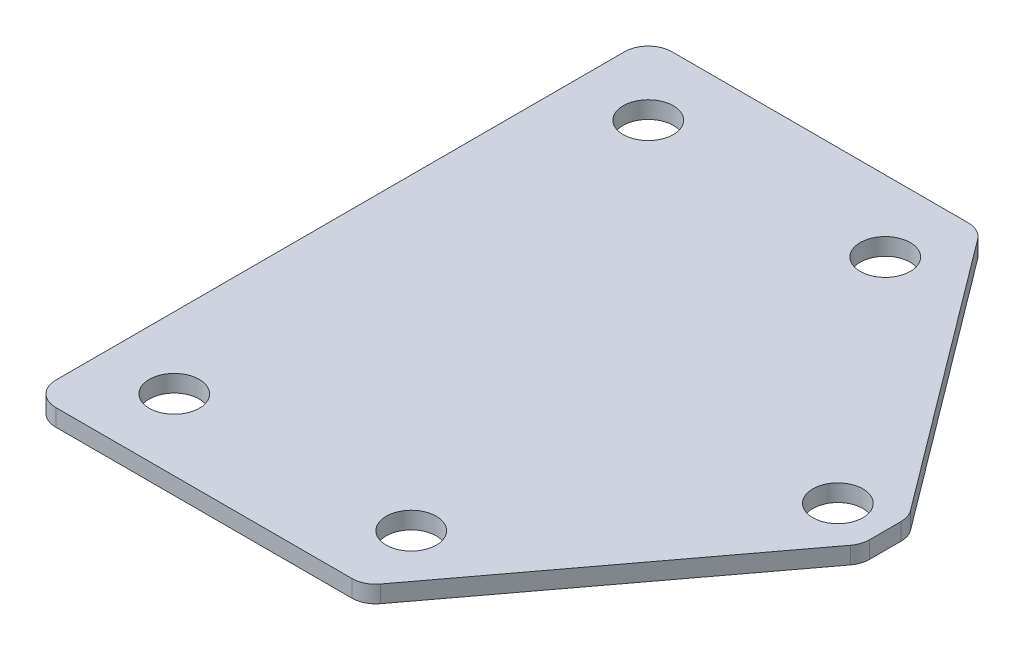
ISO-10303-21;
HEADER;
FILE_DESCRIPTION(('STEP AP214'),'2;1');
FILE_NAME('part.step','',(''),(''),'','','');
FILE_SCHEMA(('AUTOMOTIVE_DESIGN { 1 0 10303 214 1 1 1 1 }'));
ENDSEC;
DATA;
#1=APPLICATION_CONTEXT('core data for automotive mechanical design processes');
#2=APPLICATION_PROTOCOL_DEFINITION('international standard','automotive_design',2000,#1);
#3=PRODUCT_CONTEXT('',#1,'mechanical');
#4=PRODUCT('Part','Part','',(#3));
#5=PRODUCT_RELATED_PRODUCT_CATEGORY('part','',(#4));
#6=PRODUCT_DEFINITION_FORMATION('','',#4);
#7=PRODUCT_DEFINITION_CONTEXT('part definition',#1,'design');
#8=PRODUCT_DEFINITION('design','',#6,#7);
#9=PRODUCT_DEFINITION_SHAPE('','',#8);
#10=(LENGTH_UNIT() NAMED_UNIT(*) SI_UNIT(.MILLI.,.METRE.));
#11=(NAMED_UNIT(*) PLANE_ANGLE_UNIT() SI_UNIT($,.RADIAN.));
#12=(NAMED_UNIT(*) SI_UNIT($,.STERADIAN.) SOLID_ANGLE_UNIT());
#13=UNCERTAINTY_MEASURE_WITH_UNIT(LENGTH_MEASURE(1.E-05),#10,'distance_accuracy_value','');
#14=(GEOMETRIC_REPRESENTATION_CONTEXT(3) GLOBAL_UNCERTAINTY_ASSIGNED_CONTEXT((#13)) GLOBAL_UNIT_ASSIGNED_CONTEXT((#10,
#11,#12)) REPRESENTATION_CONTEXT('',''));
#15=CARTESIAN_POINT('',(0.,0.,0.));
#16=DIRECTION('',(0.,0.,1.));
#17=DIRECTION('',(1.,0.,0.));
#18=AXIS2_PLACEMENT_3D('',#15,#16,#17);
#19=CARTESIAN_POINT('',(0.,0.,0.));
#20=DIRECTION('',(0.,-1.,0.));
#21=DIRECTION('',(0.,0.,-1.));
#22=AXIS2_PLACEMENT_3D('',#19,#20,#21);
#23=PLANE('',#22);
#24=CARTESIAN_POINT('',(4.7625,0.,9.525));
#25=DIRECTION('',(0.,1.,0.));
#26=DIRECTION('',(0.,0.,1.));
#27=AXIS2_PLACEMENT_3D('',#24,#25,#26);
#28=CIRCLE('',#27,3.3528);
#29=CARTESIAN_POINT('',(4.7625,0.,12.8778));
#30=VERTEX_POINT('',#29);
#31=EDGE_CURVE('E194',#30,#30,#28,.T.);
#32=ORIENTED_EDGE('',*,*,#31,.T.);
#33=EDGE_LOOP('',(#32));
#34=FACE_BOUND('',#33,.T.);
#35=CARTESIAN_POINT('',(4.7625,0.,73.025));
#36=DIRECTION('',(0.,1.,0.));
#37=DIRECTION('',(0.,0.,1.));
#38=AXIS2_PLACEMENT_3D('',#35,#36,#37);
#39=CIRCLE('',#38,3.3528);
#40=CARTESIAN_POINT('',(4.7625,0.,76.3778));
#41=VERTEX_POINT('',#40);
#42=EDGE_CURVE('E133',#41,#41,#39,.T.);
#43=ORIENTED_EDGE('',*,*,#42,.T.);
#44=EDGE_LOOP('',(#43));
#45=FACE_BOUND('',#44,.T.);
#46=CARTESIAN_POINT('',(-26.9875,0.,73.025));
#47=DIRECTION('',(0.,1.,0.));
#48=DIRECTION('',(0.,0.,1.));
#49=AXIS2_PLACEMENT_3D('',#46,#47,#48);
#50=CIRCLE('',#49,3.3528);
#51=CARTESIAN_POINT('',(-26.9875,0.,76.3778));
#52=VERTEX_POINT('',#51);
#53=EDGE_CURVE('E116',#52,#52,#50,.T.);
#54=ORIENTED_EDGE('',*,*,#53,.T.);
#55=EDGE_LOOP('',(#54));
#56=FACE_BOUND('',#55,.T.);
#57=CARTESIAN_POINT('',(-26.9875,0.,9.525));
#58=DIRECTION('',(0.,1.,0.));
#59=DIRECTION('',(0.,0.,1.));
#60=AXIS2_PLACEMENT_3D('',#57,#58,#59);
#61=CIRCLE('',#60,3.3528);
#62=CARTESIAN_POINT('',(-26.9875,0.,12.8778));
#63=VERTEX_POINT('',#62);
#64=EDGE_CURVE('E216',#63,#63,#61,.T.);
#65=ORIENTED_EDGE('',*,*,#64,.T.);
#66=EDGE_LOOP('',(#65));
#67=FACE_BOUND('',#66,.T.);
#68=CARTESIAN_POINT('',(30.1625,0.,41.275));
#69=DIRECTION('',(0.,1.,0.));
#70=DIRECTION('',(0.,0.,1.));
#71=AXIS2_PLACEMENT_3D('',#68,#69,#70);
#72=CIRCLE('',#71,3.3528);
#73=CARTESIAN_POINT('',(30.1625,0.,44.6278));
#74=VERTEX_POINT('',#73);
#75=EDGE_CURVE('E221',#74,#74,#72,.T.);
#76=ORIENTED_EDGE('',*,*,#75,.T.);
#77=EDGE_LOOP('',(#76));
#78=FACE_BOUND('',#77,.T.);
#79=DIRECTION('',(1.,0.,0.));
#80=VECTOR('',#79,1.);
#81=CARTESIAN_POINT('',(-36.5125,0.,0.));
#82=LINE('',#81,#80);
#83=CARTESIAN_POINT('',(-33.3375,0.,0.));
#84=VERTEX_POINT('',#83);
#85=CARTESIAN_POINT('',(6.35,0.,0.));
#86=VERTEX_POINT('',#85);
#87=EDGE_CURVE('E139',#84,#86,#82,.T.);
#88=ORIENTED_EDGE('',*,*,#87,.T.);
#89=CARTESIAN_POINT('',(6.35,0.,3.175));
#90=DIRECTION('',(0.,1.,0.));
#91=DIRECTION('',(0.,0.,1.));
#92=AXIS2_PLACEMENT_3D('',#89,#90,#91);
#93=CIRCLE('',#92,3.175);
#94=CARTESIAN_POINT('',(8.89,0.,1.27));
#95=VERTEX_POINT('',#94);
#96=EDGE_CURVE('E141',#95,#86,#93,.T.);
#97=ORIENTED_EDGE('',*,*,#96,.F.);
#98=DIRECTION('',(0.6,0.,0.8));
#99=VECTOR('',#98,1.);
#100=CARTESIAN_POINT('',(7.9375,0.,0.));
#101=LINE('',#100,#99);
#102=CARTESIAN_POINT('',(35.8775,0.,37.2533333333333));
#103=VERTEX_POINT('',#102);
#104=EDGE_CURVE('E134',#95,#103,#101,.T.);
#105=ORIENTED_EDGE('',*,*,#104,.T.);
#106=CARTESIAN_POINT('',(33.3375,0.,39.1583333333333));
#107=DIRECTION('',(0.,1.,0.));
#108=DIRECTION('',(0.,0.,1.));
#109=AXIS2_PLACEMENT_3D('',#106,#107,#108);
#110=CIRCLE('',#109,3.175);
#111=CARTESIAN_POINT('',(36.5125,0.,39.1583333333333));
#112=VERTEX_POINT('',#111);
#113=EDGE_CURVE('E137',#112,#103,#110,.T.);
#114=ORIENTED_EDGE('',*,*,#113,.F.);
#115=DIRECTION('',(0.,0.,1.));
#116=VECTOR('',#115,1.);
#117=CARTESIAN_POINT('',(36.5125,0.,82.55));
#118=LINE('',#117,#116);
#119=CARTESIAN_POINT('',(36.5125,0.,43.3916666666667));
#120=VERTEX_POINT('',#119);
#121=EDGE_CURVE('E110',#112,#120,#118,.T.);
#122=ORIENTED_EDGE('',*,*,#121,.T.);
#123=CARTESIAN_POINT('',(33.3375,0.,43.3916666666667));
#124=DIRECTION('',(0.,1.,0.));
#125=DIRECTION('',(0.,0.,1.));
#126=AXIS2_PLACEMENT_3D('',#123,#124,#125);
#127=CIRCLE('',#126,3.175);
#128=CARTESIAN_POINT('',(35.8775,0.,45.2966666666667));
#129=VERTEX_POINT('',#128);
#130=EDGE_CURVE('E105',#129,#120,#127,.T.);
#131=ORIENTED_EDGE('',*,*,#130,.F.);
#132=DIRECTION('',(-0.6,0.,0.8));
#133=VECTOR('',#132,1.);
#134=CARTESIAN_POINT('',(36.5125,0.,44.45));
#135=LINE('',#134,#133);
#136=CARTESIAN_POINT('',(8.89,0.,81.28));
#137=VERTEX_POINT('',#136);
#138=EDGE_CURVE('E108',#129,#137,#135,.T.);
#139=ORIENTED_EDGE('',*,*,#138,.T.);
#140=CARTESIAN_POINT('',(6.35,0.,79.375));
#141=DIRECTION('',(0.,1.,0.));
#142=DIRECTION('',(0.,0.,1.));
#143=AXIS2_PLACEMENT_3D('',#140,#141,#142);
#144=CIRCLE('',#143,3.175);
#145=CARTESIAN_POINT('',(6.35,0.,82.55));
#146=VERTEX_POINT('',#145);
#147=EDGE_CURVE('E123',#146,#137,#144,.T.);
#148=ORIENTED_EDGE('',*,*,#147,.F.);
#149=DIRECTION('',(-1.,0.,0.));
#150=VECTOR('',#149,1.);
#151=CARTESIAN_POINT('',(-36.5125,0.,82.55));
#152=LINE('',#151,#150);
#153=CARTESIAN_POINT('',(-33.3375,0.,82.55));
#154=VERTEX_POINT('',#153);
#155=EDGE_CURVE('E148',#146,#154,#152,.T.);
#156=ORIENTED_EDGE('',*,*,#155,.T.);
#157=CARTESIAN_POINT('',(-33.3375,0.,79.375));
#158=DIRECTION('',(0.,-1.,0.));
#159=DIRECTION('',(0.,0.,-1.));
#160=AXIS2_PLACEMENT_3D('',#157,#158,#159);
#161=CIRCLE('',#160,3.175);
#162=CARTESIAN_POINT('',(-36.5125,0.,79.375));
#163=VERTEX_POINT('',#162);
#164=EDGE_CURVE('E150',#163,#154,#161,.F.);
#165=ORIENTED_EDGE('',*,*,#164,.F.);
#166=DIRECTION('',(0.,0.,-1.));
#167=VECTOR('',#166,1.);
#168=CARTESIAN_POINT('',(-36.5125,0.,82.55));
#169=LINE('',#168,#167);
#170=CARTESIAN_POINT('',(-36.5125,0.,3.175));
#171=VERTEX_POINT('',#170);
#172=EDGE_CURVE('E143',#163,#171,#169,.T.);
#173=ORIENTED_EDGE('',*,*,#172,.T.);
#174=CARTESIAN_POINT('',(-33.3375,0.,3.175));
#175=DIRECTION('',(0.,-1.,0.));
#176=DIRECTION('',(0.,0.,-1.));
#177=AXIS2_PLACEMENT_3D('',#174,#175,#176);
#178=CIRCLE('',#177,3.175);
#179=EDGE_CURVE('E146',#84,#171,#178,.F.);
#180=ORIENTED_EDGE('',*,*,#179,.F.);
#181=EDGE_LOOP('',(#88,#97,#105,#114,#122,#131,#139,#148,#156,#165,#173,#180));
#182=FACE_BOUND('',#181,.T.);
#183=ADVANCED_FACE('F17',(#34,#45,#56,#67,#78,#182),#23,.T.);
#184=CARTESIAN_POINT('',(30.1625,0.,41.275));
#185=DIRECTION('',(0.,1.,0.));
#186=DIRECTION('',(0.,0.,1.));
#187=AXIS2_PLACEMENT_3D('',#184,#185,#186);
#188=CYLINDRICAL_SURFACE('',#187,3.3528);
#189=CARTESIAN_POINT('',(30.1625,2.286,41.275));
#190=DIRECTION('',(0.,1.,0.));
#191=DIRECTION('',(0.,0.,1.));
#192=AXIS2_PLACEMENT_3D('',#189,#190,#191);
#193=CIRCLE('',#192,3.3528);
#194=CARTESIAN_POINT('',(30.1625,2.286,44.6278));
#195=VERTEX_POINT('',#194);
#196=EDGE_CURVE('E189',#195,#195,#193,.T.);
#197=ORIENTED_EDGE('',*,*,#196,.T.);
#198=EDGE_LOOP('',(#197));
#199=FACE_BOUND('',#198,.T.);
#200=ORIENTED_EDGE('',*,*,#75,.F.);
#201=EDGE_LOOP('',(#200));
#202=FACE_BOUND('',#201,.T.);
#203=ADVANCED_FACE('F227',(#199,#202),#188,.F.);
#204=CARTESIAN_POINT('',(-26.9875,0.,9.525));
#205=DIRECTION('',(0.,1.,0.));
#206=DIRECTION('',(0.,0.,1.));
#207=AXIS2_PLACEMENT_3D('',#204,#205,#206);
#208=CYLINDRICAL_SURFACE('',#207,3.3528);
#209=CARTESIAN_POINT('',(-26.9875,2.286,9.525));
#210=DIRECTION('',(0.,1.,0.));
#211=DIRECTION('',(0.,0.,1.));
#212=AXIS2_PLACEMENT_3D('',#209,#210,#211);
#213=CIRCLE('',#212,3.3528);
#214=CARTESIAN_POINT('',(-26.9875,2.286,12.8778));
#215=VERTEX_POINT('',#214);
#216=EDGE_CURVE('E184',#215,#215,#213,.T.);
#217=ORIENTED_EDGE('',*,*,#216,.T.);
#218=EDGE_LOOP('',(#217));
#219=FACE_BOUND('',#218,.T.);
#220=ORIENTED_EDGE('',*,*,#64,.F.);
#221=EDGE_LOOP('',(#220));
#222=FACE_BOUND('',#221,.T.);
#223=ADVANCED_FACE('F229',(#219,#222),#208,.F.);
#224=CARTESIAN_POINT('',(-26.9875,0.,73.025));
#225=DIRECTION('',(0.,1.,0.));
#226=DIRECTION('',(0.,0.,1.));
#227=AXIS2_PLACEMENT_3D('',#224,#225,#226);
#228=CYLINDRICAL_SURFACE('',#227,3.3528);
#229=CARTESIAN_POINT('',(-26.9875,2.286,73.025));
#230=DIRECTION('',(0.,1.,0.));
#231=DIRECTION('',(0.,0.,1.));
#232=AXIS2_PLACEMENT_3D('',#229,#230,#231);
#233=CIRCLE('',#232,3.3528);
#234=CARTESIAN_POINT('',(-26.9875,2.286,76.3778));
#235=VERTEX_POINT('',#234);
#236=EDGE_CURVE('E181',#235,#235,#233,.T.);
#237=ORIENTED_EDGE('',*,*,#236,.T.);
#238=EDGE_LOOP('',(#237));
#239=FACE_BOUND('',#238,.T.);
#240=ORIENTED_EDGE('',*,*,#53,.F.);
#241=EDGE_LOOP('',(#240));
#242=FACE_BOUND('',#241,.T.);
#243=ADVANCED_FACE('F236',(#239,#242),#228,.F.);
#244=CARTESIAN_POINT('',(33.3375,0.,43.3916666666667));
#245=DIRECTION('',(0.,1.,0.));
#246=DIRECTION('',(0.,0.,1.));
#247=AXIS2_PLACEMENT_3D('',#244,#245,#246);
#248=CYLINDRICAL_SURFACE('',#247,3.175);
#249=CARTESIAN_POINT('',(33.3375,2.286,43.3916666666667));
#250=DIRECTION('',(0.,1.,0.));
#251=DIRECTION('',(0.,0.,1.));
#252=AXIS2_PLACEMENT_3D('',#249,#250,#251);
#253=CIRCLE('',#252,3.175);
#254=CARTESIAN_POINT('',(36.5125,2.286,43.3916666666667));
#255=VERTEX_POINT('',#254);
#256=CARTESIAN_POINT('',(35.8775,2.286,45.2966666666667));
#257=VERTEX_POINT('',#256);
#258=EDGE_CURVE('E127',#255,#257,#253,.F.);
#259=ORIENTED_EDGE('',*,*,#258,.T.);
#260=DIRECTION('',(0.,1.,0.));
#261=VECTOR('',#260,1.);
#262=CARTESIAN_POINT('',(35.8775,0.,45.2966666666667));
#263=LINE('',#262,#261);
#264=EDGE_CURVE('E115',#257,#129,#263,.F.);
#265=ORIENTED_EDGE('',*,*,#264,.T.);
#266=ORIENTED_EDGE('',*,*,#130,.T.);
#267=DIRECTION('',(0.,1.,0.));
#268=VECTOR('',#267,1.);
#269=CARTESIAN_POINT('',(36.5125,2.286,43.3916666666667));
#270=LINE('',#269,#268);
#271=EDGE_CURVE('E443',#120,#255,#270,.T.);
#272=ORIENTED_EDGE('',*,*,#271,.T.);
#273=EDGE_LOOP('',(#259,#265,#266,#272));
#274=FACE_BOUND('',#273,.T.);
#275=ADVANCED_FACE('F126',(#274),#248,.T.);
#276=CARTESIAN_POINT('',(36.5125,0.,44.45));
#277=DIRECTION('',(-0.8,0.,-0.6));
#278=DIRECTION('',(-0.6,0.,0.8));
#279=AXIS2_PLACEMENT_3D('',#276,#277,#278);
#280=PLANE('',#279);
#281=ORIENTED_EDGE('',*,*,#264,.F.);
#282=DIRECTION('',(-0.6,0.,0.8));
#283=VECTOR('',#282,1.);
#284=CARTESIAN_POINT('',(35.8775,2.286,45.2966666666667));
#285=LINE('',#284,#283);
#286=CARTESIAN_POINT('',(8.89,2.286,81.28));
#287=VERTEX_POINT('',#286);
#288=EDGE_CURVE('E179',#257,#287,#285,.T.);
#289=ORIENTED_EDGE('',*,*,#288,.T.);
#290=DIRECTION('',(0.,1.,0.));
#291=VECTOR('',#290,1.);
#292=CARTESIAN_POINT('',(8.89,2.286,81.28));
#293=LINE('',#292,#291);
#294=EDGE_CURVE('E122',#137,#287,#293,.T.);
#295=ORIENTED_EDGE('',*,*,#294,.F.);
#296=ORIENTED_EDGE('',*,*,#138,.F.);
#297=EDGE_LOOP('',(#281,#289,#295,#296));
#298=FACE_BOUND('',#297,.T.);
#299=ADVANCED_FACE('F119',(#298),#280,.F.);
#300=CARTESIAN_POINT('',(6.35,2.286,79.375));
#301=DIRECTION('',(0.,1.,0.));
#302=DIRECTION('',(0.,0.,1.));
#303=AXIS2_PLACEMENT_3D('',#300,#301,#302);
#304=CYLINDRICAL_SURFACE('',#303,3.175);
#305=CARTESIAN_POINT('',(6.35,2.286,79.375));
#306=DIRECTION('',(0.,1.,0.));
#307=DIRECTION('',(0.,0.,1.));
#308=AXIS2_PLACEMENT_3D('',#305,#306,#307);
#309=CIRCLE('',#308,3.175);
#310=CARTESIAN_POINT('',(6.35,2.286,82.55));
#311=VERTEX_POINT('',#310);
#312=EDGE_CURVE('E176',#287,#311,#309,.F.);
#313=ORIENTED_EDGE('',*,*,#312,.T.);
#314=DIRECTION('',(0.,1.,0.));
#315=VECTOR('',#314,1.);
#316=CARTESIAN_POINT('',(6.35,2.286,82.55));
#317=LINE('',#316,#315);
#318=EDGE_CURVE('E151',#311,#146,#317,.F.);
#319=ORIENTED_EDGE('',*,*,#318,.T.);
#320=ORIENTED_EDGE('',*,*,#147,.T.);
#321=ORIENTED_EDGE('',*,*,#294,.T.);
#322=EDGE_LOOP('',(#313,#319,#320,#321));
#323=FACE_BOUND('',#322,.T.);
#324=ADVANCED_FACE('F291',(#323),#304,.T.);
#325=CARTESIAN_POINT('',(-36.5125,2.286,82.55));
#326=DIRECTION('',(0.,0.,-1.));
#327=DIRECTION('',(-1.,0.,0.));
#328=AXIS2_PLACEMENT_3D('',#325,#326,#327);
#329=PLANE('',#328);
#330=ORIENTED_EDGE('',*,*,#318,.F.);
#331=DIRECTION('',(1.,0.,0.));
#332=VECTOR('',#331,1.);
#333=CARTESIAN_POINT('',(0.,2.286,82.55));
#334=LINE('',#333,#332);
#335=CARTESIAN_POINT('',(-33.3375,2.286,82.55));
#336=VERTEX_POINT('',#335);
#337=EDGE_CURVE('E175',#311,#336,#334,.F.);
#338=ORIENTED_EDGE('',*,*,#337,.T.);
#339=DIRECTION('',(0.,-1.,0.));
#340=VECTOR('',#339,1.);
#341=CARTESIAN_POINT('',(-33.3375,2.286,82.55));
#342=LINE('',#341,#340);
#343=EDGE_CURVE('E212',#154,#336,#342,.F.);
#344=ORIENTED_EDGE('',*,*,#343,.F.);
#345=ORIENTED_EDGE('',*,*,#155,.F.);
#346=EDGE_LOOP('',(#330,#338,#344,#345));
#347=FACE_BOUND('',#346,.T.);
#348=ADVANCED_FACE('F287',(#347),#329,.F.);
#349=CARTESIAN_POINT('',(-33.3375,2.286,79.375));
#350=DIRECTION('',(0.,-1.,0.));
#351=DIRECTION('',(0.,0.,-1.));
#352=AXIS2_PLACEMENT_3D('',#349,#350,#351);
#353=CYLINDRICAL_SURFACE('',#352,3.175);
#354=ORIENTED_EDGE('',*,*,#164,.T.);
#355=ORIENTED_EDGE('',*,*,#343,.T.);
#356=CARTESIAN_POINT('',(-33.3375,2.286,79.375));
#357=DIRECTION('',(0.,-1.,0.));
#358=DIRECTION('',(0.,0.,-1.));
#359=AXIS2_PLACEMENT_3D('',#356,#357,#358);
#360=CIRCLE('',#359,3.175);
#361=CARTESIAN_POINT('',(-36.5125,2.286,79.375));
#362=VERTEX_POINT('',#361);
#363=EDGE_CURVE('E172',#336,#362,#360,.T.);
#364=ORIENTED_EDGE('',*,*,#363,.T.);
#365=DIRECTION('',(0.,1.,0.));
#366=VECTOR('',#365,1.);
#367=CARTESIAN_POINT('',(-36.5125,2.286,79.375));
#368=LINE('',#367,#366);
#369=EDGE_CURVE('E147',#362,#163,#368,.F.);
#370=ORIENTED_EDGE('',*,*,#369,.T.);
#371=EDGE_LOOP('',(#354,#355,#364,#370));
#372=FACE_BOUND('',#371,.T.);
#373=ADVANCED_FACE('F283',(#372),#353,.T.);
#374=CARTESIAN_POINT('',(-36.5125,2.286,82.55));
#375=DIRECTION('',(1.,0.,0.));
#376=DIRECTION('',(0.,0.,-1.));
#377=AXIS2_PLACEMENT_3D('',#374,#375,#376);
#378=PLANE('',#377);
#379=ORIENTED_EDGE('',*,*,#369,.F.);
#380=DIRECTION('',(0.,0.,-1.));
#381=VECTOR('',#380,1.);
#382=CARTESIAN_POINT('',(-36.5125,2.286,0.));
#383=LINE('',#382,#381);
#384=CARTESIAN_POINT('',(-36.5125,2.286,3.175));
#385=VERTEX_POINT('',#384);
#386=EDGE_CURVE('E171',#362,#385,#383,.T.);
#387=ORIENTED_EDGE('',*,*,#386,.T.);
#388=DIRECTION('',(0.,-1.,0.));
#389=VECTOR('',#388,1.);
#390=CARTESIAN_POINT('',(-36.5125,2.286,3.175));
#391=LINE('',#390,#389);
#392=EDGE_CURVE('E210',#171,#385,#391,.F.);
#393=ORIENTED_EDGE('',*,*,#392,.F.);
#394=ORIENTED_EDGE('',*,*,#172,.F.);
#395=EDGE_LOOP('',(#379,#387,#393,#394));
#396=FACE_BOUND('',#395,.T.);
#397=ADVANCED_FACE('F279',(#396),#378,.F.);
#398=CARTESIAN_POINT('',(-33.3375,2.286,3.175));
#399=DIRECTION('',(0.,-1.,0.));
#400=DIRECTION('',(0.,0.,-1.));
#401=AXIS2_PLACEMENT_3D('',#398,#399,#400);
#402=CYLINDRICAL_SURFACE('',#401,3.175);
#403=ORIENTED_EDGE('',*,*,#179,.T.);
#404=ORIENTED_EDGE('',*,*,#392,.T.);
#405=CARTESIAN_POINT('',(-33.3375,2.286,3.175));
#406=DIRECTION('',(0.,-1.,0.));
#407=DIRECTION('',(0.,0.,-1.));
#408=AXIS2_PLACEMENT_3D('',#405,#406,#407);
#409=CIRCLE('',#408,3.175);
#410=CARTESIAN_POINT('',(-33.3375,2.286,0.));
#411=VERTEX_POINT('',#410);
#412=EDGE_CURVE('E168',#385,#411,#409,.T.);
#413=ORIENTED_EDGE('',*,*,#412,.T.);
#414=DIRECTION('',(0.,1.,0.));
#415=VECTOR('',#414,1.);
#416=CARTESIAN_POINT('',(-33.3375,2.286,0.));
#417=LINE('',#416,#415);
#418=EDGE_CURVE('E142',#411,#84,#417,.F.);
#419=ORIENTED_EDGE('',*,*,#418,.T.);
#420=EDGE_LOOP('',(#403,#404,#413,#419));
#421=FACE_BOUND('',#420,.T.);
#422=ADVANCED_FACE('F275',(#421),#402,.T.);
#423=CARTESIAN_POINT('',(-36.5125,2.286,0.));
#424=DIRECTION('',(0.,0.,1.));
#425=DIRECTION('',(1.,0.,0.));
#426=AXIS2_PLACEMENT_3D('',#423,#424,#425);
#427=PLANE('',#426);
#428=DIRECTION('',(0.,1.,0.));
#429=VECTOR('',#428,1.);
#430=CARTESIAN_POINT('',(6.35,0.,0.));
#431=LINE('',#430,#429);
#432=CARTESIAN_POINT('',(6.35,2.286,0.));
#433=VERTEX_POINT('',#432);
#434=EDGE_CURVE('E208',#86,#433,#431,.T.);
#435=ORIENTED_EDGE('',*,*,#434,.F.);
#436=ORIENTED_EDGE('',*,*,#87,.F.);
#437=ORIENTED_EDGE('',*,*,#418,.F.);
#438=DIRECTION('',(1.,0.,0.));
#439=VECTOR('',#438,1.);
#440=CARTESIAN_POINT('',(0.,2.286,0.));
#441=LINE('',#440,#439);
#442=EDGE_CURVE('E167',#411,#433,#441,.T.);
#443=ORIENTED_EDGE('',*,*,#442,.T.);
#444=EDGE_LOOP('',(#435,#436,#437,#443));
#445=FACE_BOUND('',#444,.T.);
#446=ADVANCED_FACE('F271',(#445),#427,.F.);
#447=CARTESIAN_POINT('',(6.35,0.,3.175));
#448=DIRECTION('',(0.,1.,0.));
#449=DIRECTION('',(0.,0.,1.));
#450=AXIS2_PLACEMENT_3D('',#447,#448,#449);
#451=CYLINDRICAL_SURFACE('',#450,3.175);
#452=CARTESIAN_POINT('',(6.35,2.286,3.175));
#453=DIRECTION('',(0.,1.,0.));
#454=DIRECTION('',(0.,0.,1.));
#455=AXIS2_PLACEMENT_3D('',#452,#453,#454);
#456=CIRCLE('',#455,3.175);
#457=CARTESIAN_POINT('',(8.89,2.286,1.27));
#458=VERTEX_POINT('',#457);
#459=EDGE_CURVE('E164',#433,#458,#456,.F.);
#460=ORIENTED_EDGE('',*,*,#459,.T.);
#461=DIRECTION('',(0.,1.,0.));
#462=VECTOR('',#461,1.);
#463=CARTESIAN_POINT('',(8.89,0.,1.27));
#464=LINE('',#463,#462);
#465=EDGE_CURVE('E138',#458,#95,#464,.F.);
#466=ORIENTED_EDGE('',*,*,#465,.T.);
#467=ORIENTED_EDGE('',*,*,#96,.T.);
#468=ORIENTED_EDGE('',*,*,#434,.T.);
#469=EDGE_LOOP('',(#460,#466,#467,#468));
#470=FACE_BOUND('',#469,.T.);
#471=ADVANCED_FACE('F267',(#470),#451,.T.);
#472=CARTESIAN_POINT('',(7.9375,0.,0.));
#473=DIRECTION('',(-0.8,0.,0.6));
#474=DIRECTION('',(0.6,0.,0.8));
#475=AXIS2_PLACEMENT_3D('',#472,#473,#474);
#476=PLANE('',#475);
#477=DIRECTION('',(0.,1.,0.));
#478=VECTOR('',#477,1.);
#479=CARTESIAN_POINT('',(35.8775,2.286,37.2533333333333));
#480=LINE('',#479,#478);
#481=CARTESIAN_POINT('',(35.8775,2.286,37.2533333333333));
#482=VERTEX_POINT('',#481);
#483=EDGE_CURVE('E206',#103,#482,#480,.T.);
#484=ORIENTED_EDGE('',*,*,#483,.F.);
#485=ORIENTED_EDGE('',*,*,#104,.F.);
#486=ORIENTED_EDGE('',*,*,#465,.F.);
#487=DIRECTION('',(0.6,0.,0.8));
#488=VECTOR('',#487,1.);
#489=CARTESIAN_POINT('',(8.89,2.286,1.27));
#490=LINE('',#489,#488);
#491=EDGE_CURVE('E163',#458,#482,#490,.T.);
#492=ORIENTED_EDGE('',*,*,#491,.T.);
#493=EDGE_LOOP('',(#484,#485,#486,#492));
#494=FACE_BOUND('',#493,.T.);
#495=ADVANCED_FACE('F263',(#494),#476,.F.);
#496=CARTESIAN_POINT('',(33.3375,2.286,39.1583333333333));
#497=DIRECTION('',(0.,1.,0.));
#498=DIRECTION('',(0.,0.,1.));
#499=AXIS2_PLACEMENT_3D('',#496,#497,#498);
#500=CYLINDRICAL_SURFACE('',#499,3.175);
#501=CARTESIAN_POINT('',(33.3375,2.286,39.1583333333333));
#502=DIRECTION('',(0.,1.,0.));
#503=DIRECTION('',(0.,0.,1.));
#504=AXIS2_PLACEMENT_3D('',#501,#502,#503);
#505=CIRCLE('',#504,3.175);
#506=CARTESIAN_POINT('',(36.5125,2.286,39.1583333333333));
#507=VERTEX_POINT('',#506);
#508=EDGE_CURVE('E160',#482,#507,#505,.F.);
#509=ORIENTED_EDGE('',*,*,#508,.T.);
#510=DIRECTION('',(0.,1.,0.));
#511=VECTOR('',#510,1.);
#512=CARTESIAN_POINT('',(36.5125,2.286,39.1583333333333));
#513=LINE('',#512,#511);
#514=EDGE_CURVE('E35',#507,#112,#513,.F.);
#515=ORIENTED_EDGE('',*,*,#514,.T.);
#516=ORIENTED_EDGE('',*,*,#113,.T.);
#517=ORIENTED_EDGE('',*,*,#483,.T.);
#518=EDGE_LOOP('',(#509,#515,#516,#517));
#519=FACE_BOUND('',#518,.T.);
#520=ADVANCED_FACE('F260',(#519),#500,.T.);
#521=CARTESIAN_POINT('',(36.5125,2.286,82.55));
#522=DIRECTION('',(-1.,0.,0.));
#523=DIRECTION('',(0.,0.,1.));
#524=AXIS2_PLACEMENT_3D('',#521,#522,#523);
#525=PLANE('',#524);
#526=ORIENTED_EDGE('',*,*,#514,.F.);
#527=DIRECTION('',(0.,0.,-1.));
#528=VECTOR('',#527,1.);
#529=CARTESIAN_POINT('',(36.5125,2.286,0.));
#530=LINE('',#529,#528);
#531=EDGE_CURVE('E157',#507,#255,#530,.F.);
#532=ORIENTED_EDGE('',*,*,#531,.T.);
#533=ORIENTED_EDGE('',*,*,#271,.F.);
#534=ORIENTED_EDGE('',*,*,#121,.F.);
#535=EDGE_LOOP('',(#526,#532,#533,#534));
#536=FACE_BOUND('',#535,.T.);
#537=ADVANCED_FACE('F256',(#536),#525,.F.);
#538=CARTESIAN_POINT('',(4.7625,0.,73.025));
#539=DIRECTION('',(0.,1.,0.));
#540=DIRECTION('',(0.,0.,1.));
#541=AXIS2_PLACEMENT_3D('',#538,#539,#540);
#542=CYLINDRICAL_SURFACE('',#541,3.3528);
#543=CARTESIAN_POINT('',(4.7625,2.286,73.025));
#544=DIRECTION('',(0.,1.,0.));
#545=DIRECTION('',(0.,0.,1.));
#546=AXIS2_PLACEMENT_3D('',#543,#544,#545);
#547=CIRCLE('',#546,3.3528);
#548=CARTESIAN_POINT('',(4.7625,2.286,76.3778));
#549=VERTEX_POINT('',#548);
#550=EDGE_CURVE('E26',#549,#549,#547,.T.);
#551=ORIENTED_EDGE('',*,*,#550,.T.);
#552=EDGE_LOOP('',(#551));
#553=FACE_BOUND('',#552,.T.);
#554=ORIENTED_EDGE('',*,*,#42,.F.);
#555=EDGE_LOOP('',(#554));
#556=FACE_BOUND('',#555,.T.);
#557=ADVANCED_FACE('F248',(#553,#556),#542,.F.);
#558=CARTESIAN_POINT('',(4.7625,0.,9.525));
#559=DIRECTION('',(0.,1.,0.));
#560=DIRECTION('',(0.,0.,1.));
#561=AXIS2_PLACEMENT_3D('',#558,#559,#560);
#562=CYLINDRICAL_SURFACE('',#561,3.3528);
#563=CARTESIAN_POINT('',(4.7625,2.286,9.525));
#564=DIRECTION('',(0.,1.,0.));
#565=DIRECTION('',(0.,0.,1.));
#566=AXIS2_PLACEMENT_3D('',#563,#564,#565);
#567=CIRCLE('',#566,3.3528);
#568=CARTESIAN_POINT('',(4.7625,2.286,12.8778));
#569=VERTEX_POINT('',#568);
#570=EDGE_CURVE('E11',#569,#569,#567,.T.);
#571=ORIENTED_EDGE('',*,*,#570,.T.);
#572=EDGE_LOOP('',(#571));
#573=FACE_BOUND('',#572,.T.);
#574=ORIENTED_EDGE('',*,*,#31,.F.);
#575=EDGE_LOOP('',(#574));
#576=FACE_BOUND('',#575,.T.);
#577=ADVANCED_FACE('F242',(#573,#576),#562,.F.);
#578=CARTESIAN_POINT('',(0.,2.286,0.));
#579=DIRECTION('',(0.,-1.,0.));
#580=DIRECTION('',(0.,0.,-1.));
#581=AXIS2_PLACEMENT_3D('',#578,#579,#580);
#582=PLANE('',#581);
#583=ORIENTED_EDGE('',*,*,#570,.F.);
#584=EDGE_LOOP('',(#583));
#585=FACE_BOUND('',#584,.T.);
#586=ORIENTED_EDGE('',*,*,#550,.F.);
#587=EDGE_LOOP('',(#586));
#588=FACE_BOUND('',#587,.T.);
#589=ORIENTED_EDGE('',*,*,#508,.F.);
#590=ORIENTED_EDGE('',*,*,#491,.F.);
#591=ORIENTED_EDGE('',*,*,#459,.F.);
#592=ORIENTED_EDGE('',*,*,#442,.F.);
#593=ORIENTED_EDGE('',*,*,#412,.F.);
#594=ORIENTED_EDGE('',*,*,#386,.F.);
#595=ORIENTED_EDGE('',*,*,#363,.F.);
#596=ORIENTED_EDGE('',*,*,#337,.F.);
#597=ORIENTED_EDGE('',*,*,#312,.F.);
#598=ORIENTED_EDGE('',*,*,#288,.F.);
#599=ORIENTED_EDGE('',*,*,#258,.F.);
#600=ORIENTED_EDGE('',*,*,#531,.F.);
#601=EDGE_LOOP('',(#589,#590,#591,#592,#593,#594,#595,#596,#597,#598,#599,#600));
#602=FACE_BOUND('',#601,.T.);
#603=ORIENTED_EDGE('',*,*,#236,.F.);
#604=EDGE_LOOP('',(#603));
#605=FACE_BOUND('',#604,.T.);
#606=ORIENTED_EDGE('',*,*,#216,.F.);
#607=EDGE_LOOP('',(#606));
#608=FACE_BOUND('',#607,.T.);
#609=ORIENTED_EDGE('',*,*,#196,.F.);
#610=EDGE_LOOP('',(#609));
#611=FACE_BOUND('',#610,.T.);
#612=ADVANCED_FACE('F240',(#585,#588,#602,#605,#608,#611),#582,.F.);
#613=CLOSED_SHELL('',(#183,#203,#223,#243,#275,#299,#324,#348,#373,#397,#422,#446,#471,#495,
#520,#537,#557,#577,#612));
#614=MANIFOLD_SOLID_BREP('B1',#613);
#615=ADVANCED_BREP_SHAPE_REPRESENTATION('',(#18,#614),#14);
#616=SHAPE_DEFINITION_REPRESENTATION(#9,#615);
ENDSEC;
END-ISO-10303-21;
